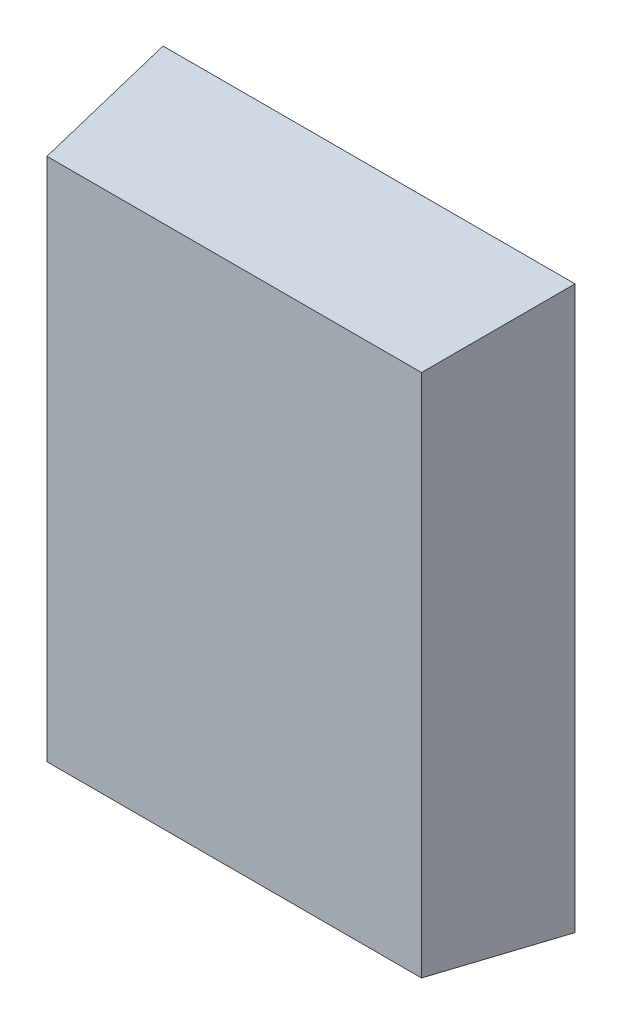
ISO-10303-21;
HEADER;
FILE_DESCRIPTION(('STEP AP214'),'2;1');
FILE_NAME('part.step','',(''),(''),'','','');
FILE_SCHEMA(('AUTOMOTIVE_DESIGN { 1 0 10303 214 1 1 1 1 }'));
ENDSEC;
DATA;
#1=APPLICATION_CONTEXT('core data for automotive mechanical design processes');
#2=APPLICATION_PROTOCOL_DEFINITION('international standard','automotive_design',2000,#1);
#3=PRODUCT_CONTEXT('',#1,'mechanical');
#4=PRODUCT('Part','Part','',(#3));
#5=PRODUCT_RELATED_PRODUCT_CATEGORY('part','',(#4));
#6=PRODUCT_DEFINITION_FORMATION('','',#4);
#7=PRODUCT_DEFINITION_CONTEXT('part definition',#1,'design');
#8=PRODUCT_DEFINITION('design','',#6,#7);
#9=PRODUCT_DEFINITION_SHAPE('','',#8);
#10=(LENGTH_UNIT() NAMED_UNIT(*) SI_UNIT(.MILLI.,.METRE.));
#11=(NAMED_UNIT(*) PLANE_ANGLE_UNIT() SI_UNIT($,.RADIAN.));
#12=(NAMED_UNIT(*) SI_UNIT($,.STERADIAN.) SOLID_ANGLE_UNIT());
#13=UNCERTAINTY_MEASURE_WITH_UNIT(LENGTH_MEASURE(1.E-05),#10,'distance_accuracy_value','');
#14=(GEOMETRIC_REPRESENTATION_CONTEXT(3) GLOBAL_UNCERTAINTY_ASSIGNED_CONTEXT((#13)) GLOBAL_UNIT_ASSIGNED_CONTEXT((#10,
#11,#12)) REPRESENTATION_CONTEXT('',''));
#15=CARTESIAN_POINT('',(0.,0.,0.));
#16=DIRECTION('',(0.,0.,1.));
#17=DIRECTION('',(1.,0.,0.));
#18=AXIS2_PLACEMENT_3D('',#15,#16,#17);
#19=CARTESIAN_POINT('',(56.499999831056,17.750004025959,0.55));
#20=DIRECTION('',(0.,0.,-1.));
#21=DIRECTION('',(-1.,0.,0.));
#22=AXIS2_PLACEMENT_3D('',#19,#20,#21);
#23=PLANE('',#22);
#24=DIRECTION('',(-1.16992029024377E-08,1.,1.62488929200852E-09));
#25=VECTOR('',#24,1.);
#26=CARTESIAN_POINT('',(56.4999998310674,17.750004025363,0.550000000081334));
#27=LINE('',#26,#25);
#28=CARTESIAN_POINT('',(56.4999998400003,17.700004025959,0.550000000000027));
#29=VERTEX_POINT('',#28);
#30=CARTESIAN_POINT('',(56.4999998481896,16.3000040287824,0.549999998862611));
#31=VERTEX_POINT('',#30);
#32=EDGE_CURVE('E53',#29,#31,#27,.F.);
#33=ORIENTED_EDGE('',*,*,#32,.T.);
#34=DIRECTION('',(1.,1.16992029691771E-08,-1.62488930127788E-09));
#35=VECTOR('',#34,1.);
#36=CARTESIAN_POINT('',(56.449999848944,16.3000040253744,0.550000000081197));
#37=LINE('',#36,#35);
#38=CARTESIAN_POINT('',(57.4999998442302,16.3000040378276,0.549999999593696));
#39=VERTEX_POINT('',#38);
#40=EDGE_CURVE('E61',#31,#39,#37,.T.);
#41=ORIENTED_EDGE('',*,*,#40,.T.);
#42=DIRECTION('',(-1.16992029024377E-08,1.,-1.62488929200852E-09));
#43=VECTOR('',#42,1.);
#44=CARTESIAN_POINT('',(57.4999998313831,17.75000403848,0.549999997643771));
#45=LINE('',#44,#43);
#46=CARTESIAN_POINT('',(57.4999998317541,17.7000040350043,0.549999999268735));
#47=VERTEX_POINT('',#46);
#48=EDGE_CURVE('E20',#39,#47,#45,.T.);
#49=ORIENTED_EDGE('',*,*,#48,.T.);
#50=DIRECTION('',(1.,1.16992028356885E-08,1.62488928273779E-09));
#51=VECTOR('',#50,1.);
#52=CARTESIAN_POINT('',(56.449999831056,17.7000040253742,0.549999999918775));
#53=LINE('',#52,#51);
#54=EDGE_CURVE('E59',#29,#47,#53,.T.);
#55=ORIENTED_EDGE('',*,*,#54,.F.);
#56=EDGE_LOOP('',(#33,#41,#49,#55));
#57=FACE_BOUND('',#56,.T.);
#58=ADVANCED_FACE('F17',(#57),#23,.F.);
#59=CARTESIAN_POINT('',(57.549999831056,17.75000403848,0.19));
#60=DIRECTION('',(-0.990492273177714,-1.18115034506066E-08,-0.13756837127496));
#61=DIRECTION('',(-0.13756837127496,0.,0.990492273177714));
#62=AXIS2_PLACEMENT_3D('',#59,#60,#61);
#63=PLANE('',#62);
#64=ORIENTED_EDGE('',*,*,#48,.F.);
#65=DIRECTION('',(0.136284818324686,-0.136284815075284,-0.981250680241345));
#66=VECTOR('',#65,1.);
#67=CARTESIAN_POINT('',(57.499999848348,16.3000040378842,0.549999999999969));
#68=LINE('',#67,#66);
#69=CARTESIAN_POINT('',(57.5499998487744,16.2500040353701,0.190000001218654));
#70=VERTEX_POINT('',#69);
#71=EDGE_CURVE('E79',#39,#70,#68,.T.);
#72=ORIENTED_EDGE('',*,*,#71,.T.);
#73=DIRECTION('',(0.,1.,0.));
#74=VECTOR('',#73,1.);
#75=CARTESIAN_POINT('',(57.549999848944,17.75000403848,0.19));
#76=LINE('',#75,#74);
#77=CARTESIAN_POINT('',(57.549999835528,17.7500040384801,0.190000000000013));
#78=VERTEX_POINT('',#77);
#79=EDGE_CURVE('E75',#70,#78,#76,.T.);
#80=ORIENTED_EDGE('',*,*,#79,.T.);
#81=DIRECTION('',(0.136284815072989,0.136284818325663,-0.981250680241528));
#82=VECTOR('',#81,1.);
#83=CARTESIAN_POINT('',(57.499999831653,17.700004037884,0.550000000000004));
#84=LINE('',#83,#82);
#85=EDGE_CURVE('E66',#47,#78,#84,.T.);
#86=ORIENTED_EDGE('',*,*,#85,.F.);
#87=EDGE_LOOP('',(#64,#72,#80,#86));
#88=FACE_BOUND('',#87,.T.);
#89=ADVANCED_FACE('F74',(#88),#63,.F.);
#90=CARTESIAN_POINT('',(56.449999831056,17.750004025363,0.19));
#91=DIRECTION('',(-1.18115033832166E-08,0.990492273177714,0.13756837127496));
#92=DIRECTION('',(0.,-0.13756837127496,0.990492273177714));
#93=AXIS2_PLACEMENT_3D('',#90,#91,#92);
#94=PLANE('',#93);
#95=DIRECTION('',(0.136284818325618,-0.13628481507562,0.981250680241169));
#96=VECTOR('',#95,1.);
#97=CARTESIAN_POINT('',(56.449999831056,17.750004025363,0.19));
#98=LINE('',#97,#96);
#99=CARTESIAN_POINT('',(56.4499998310165,17.7500040286817,0.189999999715694));
#100=VERTEX_POINT('',#99);
#101=EDGE_CURVE('E71',#100,#29,#98,.T.);
#102=ORIENTED_EDGE('',*,*,#101,.T.);
#103=ORIENTED_EDGE('',*,*,#54,.T.);
#104=ORIENTED_EDGE('',*,*,#85,.T.);
#105=DIRECTION('',(1.,0.,0.));
#106=VECTOR('',#105,1.);
#107=CARTESIAN_POINT('',(57.549999831056,17.75000403848,0.19));
#108=LINE('',#107,#106);
#109=EDGE_CURVE('E84',#78,#100,#108,.F.);
#110=ORIENTED_EDGE('',*,*,#109,.T.);
#111=EDGE_LOOP('',(#102,#103,#104,#110));
#112=FACE_BOUND('',#111,.T.);
#113=ADVANCED_FACE('F68',(#112),#94,.T.);
#114=CARTESIAN_POINT('',(56.449999831056,17.750004025363,0.19));
#115=DIRECTION('',(0.990492273177714,1.18115034506066E-08,-0.13756837127496));
#116=DIRECTION('',(-0.13756837127496,0.,-0.990492273177714));
#117=AXIS2_PLACEMENT_3D('',#114,#115,#116);
#118=PLANE('',#117);
#119=DIRECTION('',(0.,1.,0.));
#120=VECTOR('',#119,1.);
#121=CARTESIAN_POINT('',(56.449999831056,17.75000403848,0.190000000000001));
#122=LINE('',#121,#120);
#123=CARTESIAN_POINT('',(56.4499998445337,16.2500040254251,0.190000000446879));
#124=VERTEX_POINT('',#123);
#125=EDGE_CURVE('E26',#100,#124,#122,.F.);
#126=ORIENTED_EDGE('',*,*,#125,.T.);
#127=DIRECTION('',(0.136284815075643,0.136284818325613,0.981250680241167));
#128=VECTOR('',#127,1.);
#129=CARTESIAN_POINT('',(56.449999848944,16.250004025363,0.19));
#130=LINE('',#129,#128);
#131=EDGE_CURVE('E34',#124,#31,#130,.T.);
#132=ORIENTED_EDGE('',*,*,#131,.T.);
#133=ORIENTED_EDGE('',*,*,#32,.F.);
#134=ORIENTED_EDGE('',*,*,#101,.F.);
#135=EDGE_LOOP('',(#126,#132,#133,#134));
#136=FACE_BOUND('',#135,.T.);
#137=ADVANCED_FACE('F88',(#136),#118,.F.);
#138=CARTESIAN_POINT('',(56.449999848944,16.250004025363,0.19));
#139=DIRECTION('',(-1.18115035179866E-08,0.990492273177714,-0.13756837127496));
#140=DIRECTION('',(0.,0.13756837127496,0.990492273177714));
#141=AXIS2_PLACEMENT_3D('',#138,#139,#140);
#142=PLANE('',#141);
#143=ORIENTED_EDGE('',*,*,#131,.F.);
#144=DIRECTION('',(1.,0.,0.));
#145=VECTOR('',#144,1.);
#146=CARTESIAN_POINT('',(57.549999831056,16.250004025363,0.19));
#147=LINE('',#146,#145);
#148=EDGE_CURVE('E11',#124,#70,#147,.T.);
#149=ORIENTED_EDGE('',*,*,#148,.T.);
#150=ORIENTED_EDGE('',*,*,#71,.F.);
#151=ORIENTED_EDGE('',*,*,#40,.F.);
#152=EDGE_LOOP('',(#143,#149,#150,#151));
#153=FACE_BOUND('',#152,.T.);
#154=ADVANCED_FACE('F91',(#153),#142,.F.);
#155=CARTESIAN_POINT('',(57.549999831056,17.75000403848,0.19));
#156=DIRECTION('',(0.,0.,1.));
#157=DIRECTION('',(1.,0.,0.));
#158=AXIS2_PLACEMENT_3D('',#155,#156,#157);
#159=PLANE('',#158);
#160=ORIENTED_EDGE('',*,*,#125,.F.);
#161=ORIENTED_EDGE('',*,*,#109,.F.);
#162=ORIENTED_EDGE('',*,*,#79,.F.);
#163=ORIENTED_EDGE('',*,*,#148,.F.);
#164=EDGE_LOOP('',(#160,#161,#162,#163));
#165=FACE_BOUND('',#164,.T.);
#166=ADVANCED_FACE('F90',(#165),#159,.F.);
#167=CLOSED_SHELL('',(#58,#89,#113,#137,#154,#166));
#168=MANIFOLD_SOLID_BREP('B1',#167);
#169=ADVANCED_BREP_SHAPE_REPRESENTATION('',(#18,#168),#14);
#170=SHAPE_DEFINITION_REPRESENTATION(#9,#169);
ENDSEC;
END-ISO-10303-21;
